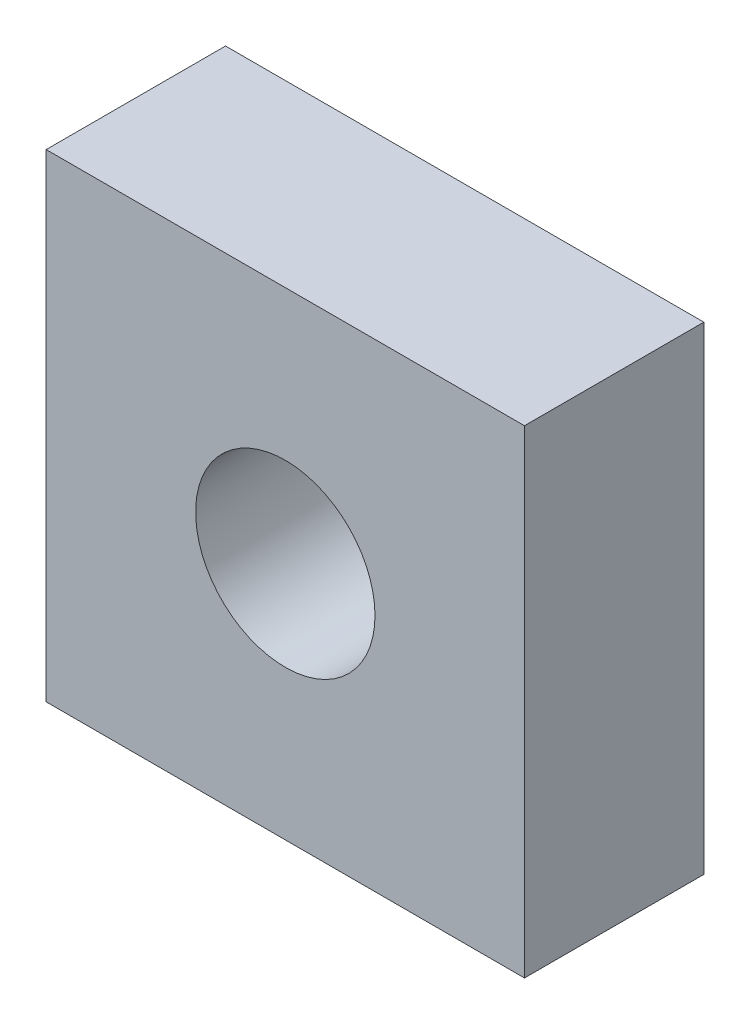
ISO-10303-21;
HEADER;
FILE_DESCRIPTION(('STEP AP214'),'2;1');
FILE_NAME('part.step','',(''),(''),'','','');
FILE_SCHEMA(('AUTOMOTIVE_DESIGN { 1 0 10303 214 1 1 1 1 }'));
ENDSEC;
DATA;
#1=APPLICATION_CONTEXT('core data for automotive mechanical design processes');
#2=APPLICATION_PROTOCOL_DEFINITION('international standard','automotive_design',2000,#1);
#3=PRODUCT_CONTEXT('',#1,'mechanical');
#4=PRODUCT('Part','Part','',(#3));
#5=PRODUCT_RELATED_PRODUCT_CATEGORY('part','',(#4));
#6=PRODUCT_DEFINITION_FORMATION('','',#4);
#7=PRODUCT_DEFINITION_CONTEXT('part definition',#1,'design');
#8=PRODUCT_DEFINITION('design','',#6,#7);
#9=PRODUCT_DEFINITION_SHAPE('','',#8);
#10=(LENGTH_UNIT() NAMED_UNIT(*) SI_UNIT(.MILLI.,.METRE.));
#11=(NAMED_UNIT(*) PLANE_ANGLE_UNIT() SI_UNIT($,.RADIAN.));
#12=(NAMED_UNIT(*) SI_UNIT($,.STERADIAN.) SOLID_ANGLE_UNIT());
#13=UNCERTAINTY_MEASURE_WITH_UNIT(LENGTH_MEASURE(1.E-05),#10,'distance_accuracy_value','');
#14=(GEOMETRIC_REPRESENTATION_CONTEXT(3) GLOBAL_UNCERTAINTY_ASSIGNED_CONTEXT((#13)) GLOBAL_UNIT_ASSIGNED_CONTEXT((#10,
#11,#12)) REPRESENTATION_CONTEXT('',''));
#15=CARTESIAN_POINT('',(0.,0.,0.));
#16=DIRECTION('',(0.,0.,1.));
#17=DIRECTION('',(1.,0.,0.));
#18=AXIS2_PLACEMENT_3D('',#15,#16,#17);
#19=CARTESIAN_POINT('',(0.,0.,3.));
#20=DIRECTION('',(1.,0.,0.));
#21=DIRECTION('',(0.,1.,0.));
#22=AXIS2_PLACEMENT_3D('',#19,#20,#21);
#23=PLANE('',#22);
#24=DIRECTION('',(0.,-1.,0.));
#25=VECTOR('',#24,1.);
#26=CARTESIAN_POINT('',(0.,0.,0.));
#27=LINE('',#26,#25);
#28=CARTESIAN_POINT('',(0.,8.,0.));
#29=VERTEX_POINT('',#28);
#30=CARTESIAN_POINT('',(0.,0.,0.));
#31=VERTEX_POINT('',#30);
#32=EDGE_CURVE('E97',#29,#31,#27,.T.);
#33=ORIENTED_EDGE('',*,*,#32,.T.);
#34=DIRECTION('',(0.,0.,-1.));
#35=VECTOR('',#34,1.);
#36=CARTESIAN_POINT('',(0.,0.,3.));
#37=LINE('',#36,#35);
#38=CARTESIAN_POINT('',(0.,0.,3.));
#39=VERTEX_POINT('',#38);
#40=EDGE_CURVE('E11',#39,#31,#37,.T.);
#41=ORIENTED_EDGE('',*,*,#40,.F.);
#42=DIRECTION('',(0.,-1.,0.));
#43=VECTOR('',#42,1.);
#44=CARTESIAN_POINT('',(0.,0.,3.));
#45=LINE('',#44,#43);
#46=CARTESIAN_POINT('',(0.,8.,3.));
#47=VERTEX_POINT('',#46);
#48=EDGE_CURVE('E85',#47,#39,#45,.T.);
#49=ORIENTED_EDGE('',*,*,#48,.F.);
#50=DIRECTION('',(0.,0.,-1.));
#51=VECTOR('',#50,1.);
#52=CARTESIAN_POINT('',(0.,8.,3.));
#53=LINE('',#52,#51);
#54=EDGE_CURVE('E93',#47,#29,#53,.T.);
#55=ORIENTED_EDGE('',*,*,#54,.T.);
#56=EDGE_LOOP('',(#33,#41,#49,#55));
#57=FACE_BOUND('',#56,.T.);
#58=ADVANCED_FACE('F34',(#57),#23,.F.);
#59=CARTESIAN_POINT('',(0.,0.,3.));
#60=DIRECTION('',(0.,1.,0.));
#61=DIRECTION('',(0.,0.,1.));
#62=AXIS2_PLACEMENT_3D('',#59,#60,#61);
#63=PLANE('',#62);
#64=DIRECTION('',(1.,0.,0.));
#65=VECTOR('',#64,1.);
#66=CARTESIAN_POINT('',(0.,0.,0.));
#67=LINE('',#66,#65);
#68=CARTESIAN_POINT('',(8.,0.,0.));
#69=VERTEX_POINT('',#68);
#70=EDGE_CURVE('E89',#31,#69,#67,.T.);
#71=ORIENTED_EDGE('',*,*,#70,.T.);
#72=DIRECTION('',(0.,0.,-1.));
#73=VECTOR('',#72,1.);
#74=CARTESIAN_POINT('',(8.,0.,3.));
#75=LINE('',#74,#73);
#76=CARTESIAN_POINT('',(8.,0.,3.));
#77=VERTEX_POINT('',#76);
#78=EDGE_CURVE('E42',#77,#69,#75,.T.);
#79=ORIENTED_EDGE('',*,*,#78,.F.);
#80=DIRECTION('',(1.,0.,0.));
#81=VECTOR('',#80,1.);
#82=CARTESIAN_POINT('',(0.,0.,3.));
#83=LINE('',#82,#81);
#84=EDGE_CURVE('E80',#39,#77,#83,.T.);
#85=ORIENTED_EDGE('',*,*,#84,.F.);
#86=ORIENTED_EDGE('',*,*,#40,.T.);
#87=EDGE_LOOP('',(#71,#79,#85,#86));
#88=FACE_BOUND('',#87,.T.);
#89=ADVANCED_FACE('F88',(#88),#63,.F.);
#90=CARTESIAN_POINT('',(8.,0.,3.));
#91=DIRECTION('',(-1.,0.,0.));
#92=DIRECTION('',(0.,-1.,0.));
#93=AXIS2_PLACEMENT_3D('',#90,#91,#92);
#94=PLANE('',#93);
#95=DIRECTION('',(0.,1.,0.));
#96=VECTOR('',#95,1.);
#97=CARTESIAN_POINT('',(8.,0.,0.));
#98=LINE('',#97,#96);
#99=CARTESIAN_POINT('',(8.,8.,0.));
#100=VERTEX_POINT('',#99);
#101=EDGE_CURVE('E67',#69,#100,#98,.T.);
#102=ORIENTED_EDGE('',*,*,#101,.T.);
#103=DIRECTION('',(0.,0.,-1.));
#104=VECTOR('',#103,1.);
#105=CARTESIAN_POINT('',(8.,8.,3.));
#106=LINE('',#105,#104);
#107=CARTESIAN_POINT('',(8.,8.,3.));
#108=VERTEX_POINT('',#107);
#109=EDGE_CURVE('E90',#108,#100,#106,.T.);
#110=ORIENTED_EDGE('',*,*,#109,.F.);
#111=DIRECTION('',(0.,1.,0.));
#112=VECTOR('',#111,1.);
#113=CARTESIAN_POINT('',(8.,0.,3.));
#114=LINE('',#113,#112);
#115=EDGE_CURVE('E83',#77,#108,#114,.T.);
#116=ORIENTED_EDGE('',*,*,#115,.F.);
#117=ORIENTED_EDGE('',*,*,#78,.T.);
#118=EDGE_LOOP('',(#102,#110,#116,#117));
#119=FACE_BOUND('',#118,.T.);
#120=ADVANCED_FACE('F91',(#119),#94,.F.);
#121=CARTESIAN_POINT('',(0.,8.,3.));
#122=DIRECTION('',(0.,-1.,0.));
#123=DIRECTION('',(0.,0.,-1.));
#124=AXIS2_PLACEMENT_3D('',#121,#122,#123);
#125=PLANE('',#124);
#126=DIRECTION('',(-1.,0.,0.));
#127=VECTOR('',#126,1.);
#128=CARTESIAN_POINT('',(0.,8.,0.));
#129=LINE('',#128,#127);
#130=EDGE_CURVE('E73',#100,#29,#129,.T.);
#131=ORIENTED_EDGE('',*,*,#130,.T.);
#132=ORIENTED_EDGE('',*,*,#54,.F.);
#133=DIRECTION('',(-1.,0.,0.));
#134=VECTOR('',#133,1.);
#135=CARTESIAN_POINT('',(0.,8.,3.));
#136=LINE('',#135,#134);
#137=EDGE_CURVE('E50',#108,#47,#136,.T.);
#138=ORIENTED_EDGE('',*,*,#137,.F.);
#139=ORIENTED_EDGE('',*,*,#109,.T.);
#140=EDGE_LOOP('',(#131,#132,#138,#139));
#141=FACE_BOUND('',#140,.T.);
#142=ADVANCED_FACE('F105',(#141),#125,.F.);
#143=CARTESIAN_POINT('',(0.,0.,3.));
#144=DIRECTION('',(0.,0.,-1.));
#145=DIRECTION('',(-1.,0.,0.));
#146=AXIS2_PLACEMENT_3D('',#143,#144,#145);
#147=PLANE('',#146);
#148=CARTESIAN_POINT('',(4.,4.,3.));
#149=DIRECTION('',(0.,0.,1.));
#150=DIRECTION('',(1.,0.,0.));
#151=AXIS2_PLACEMENT_3D('',#148,#149,#150);
#152=CIRCLE('',#151,1.5);
#153=CARTESIAN_POINT('',(5.5,4.,3.));
#154=VERTEX_POINT('',#153);
#155=EDGE_CURVE('E111',#154,#154,#152,.T.);
#156=ORIENTED_EDGE('',*,*,#155,.F.);
#157=EDGE_LOOP('',(#156));
#158=FACE_BOUND('',#157,.T.);
#159=ORIENTED_EDGE('',*,*,#48,.T.);
#160=ORIENTED_EDGE('',*,*,#84,.T.);
#161=ORIENTED_EDGE('',*,*,#115,.T.);
#162=ORIENTED_EDGE('',*,*,#137,.T.);
#163=EDGE_LOOP('',(#159,#160,#161,#162));
#164=FACE_BOUND('',#163,.T.);
#165=ADVANCED_FACE('F81',(#158,#164),#147,.F.);
#166=CARTESIAN_POINT('',(0.,0.,0.));
#167=DIRECTION('',(0.,0.,-1.));
#168=DIRECTION('',(-1.,0.,0.));
#169=AXIS2_PLACEMENT_3D('',#166,#167,#168);
#170=PLANE('',#169);
#171=CARTESIAN_POINT('',(4.,4.,0.));
#172=DIRECTION('',(0.,0.,1.));
#173=DIRECTION('',(1.,0.,0.));
#174=AXIS2_PLACEMENT_3D('',#171,#172,#173);
#175=CIRCLE('',#174,1.5);
#176=CARTESIAN_POINT('',(5.5,4.,0.));
#177=VERTEX_POINT('',#176);
#178=EDGE_CURVE('E100',#177,#177,#175,.T.);
#179=ORIENTED_EDGE('',*,*,#178,.T.);
#180=EDGE_LOOP('',(#179));
#181=FACE_BOUND('',#180,.T.);
#182=ORIENTED_EDGE('',*,*,#32,.F.);
#183=ORIENTED_EDGE('',*,*,#130,.F.);
#184=ORIENTED_EDGE('',*,*,#101,.F.);
#185=ORIENTED_EDGE('',*,*,#70,.F.);
#186=EDGE_LOOP('',(#182,#183,#184,#185));
#187=FACE_BOUND('',#186,.T.);
#188=ADVANCED_FACE('F108',(#181,#187),#170,.T.);
#189=CARTESIAN_POINT('',(4.,4.,0.));
#190=DIRECTION('',(0.,0.,1.));
#191=DIRECTION('',(1.,0.,0.));
#192=AXIS2_PLACEMENT_3D('',#189,#190,#191);
#193=CYLINDRICAL_SURFACE('',#192,1.5);
#194=ORIENTED_EDGE('',*,*,#178,.F.);
#195=EDGE_LOOP('',(#194));
#196=FACE_BOUND('',#195,.T.);
#197=ORIENTED_EDGE('',*,*,#155,.T.);
#198=EDGE_LOOP('',(#197));
#199=FACE_BOUND('',#198,.T.);
#200=ADVANCED_FACE('F118',(#196,#199),#193,.F.);
#201=CLOSED_SHELL('',(#58,#89,#120,#142,#165,#188,#200));
#202=MANIFOLD_SOLID_BREP('B2',#201);
#203=ADVANCED_BREP_SHAPE_REPRESENTATION('',(#18,#202),#14);
#204=SHAPE_DEFINITION_REPRESENTATION(#9,#203);
ENDSEC;
END-ISO-10303-21;
